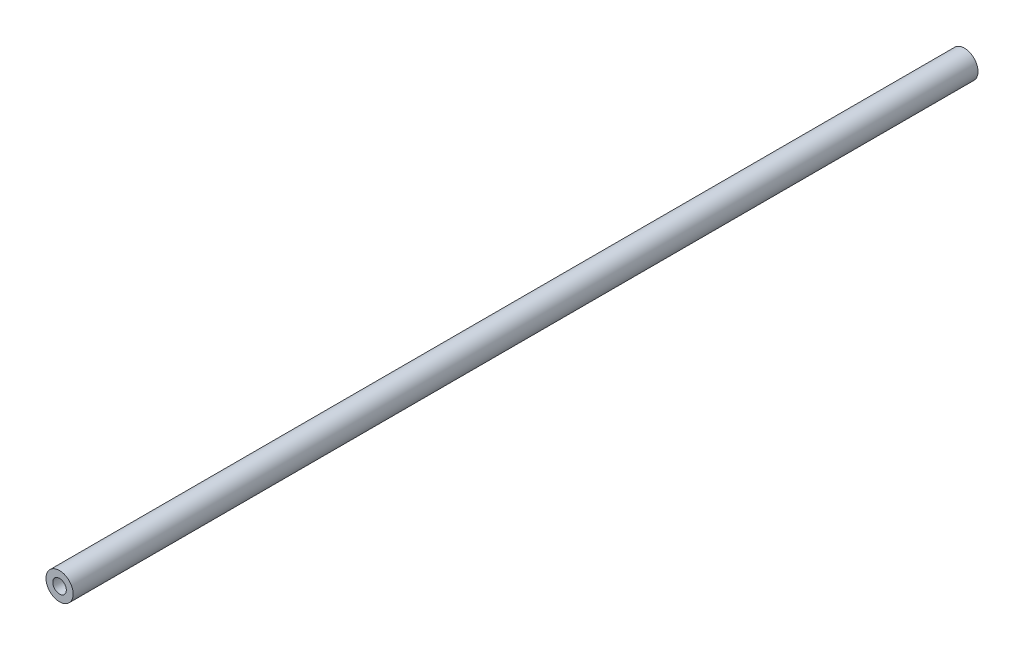
ISO-10303-21;
HEADER;
FILE_DESCRIPTION(('STEP AP214'),'2;1');
FILE_NAME('part.step','',(''),(''),'','','');
FILE_SCHEMA(('AUTOMOTIVE_DESIGN { 1 0 10303 214 1 1 1 1 }'));
ENDSEC;
DATA;
#1=APPLICATION_CONTEXT('core data for automotive mechanical design processes');
#2=APPLICATION_PROTOCOL_DEFINITION('international standard','automotive_design',2000,#1);
#3=PRODUCT_CONTEXT('',#1,'mechanical');
#4=PRODUCT('Part','Part','',(#3));
#5=PRODUCT_RELATED_PRODUCT_CATEGORY('part','',(#4));
#6=PRODUCT_DEFINITION_FORMATION('','',#4);
#7=PRODUCT_DEFINITION_CONTEXT('part definition',#1,'design');
#8=PRODUCT_DEFINITION('design','',#6,#7);
#9=PRODUCT_DEFINITION_SHAPE('','',#8);
#10=(LENGTH_UNIT() NAMED_UNIT(*) SI_UNIT(.MILLI.,.METRE.));
#11=(NAMED_UNIT(*) PLANE_ANGLE_UNIT() SI_UNIT($,.RADIAN.));
#12=(NAMED_UNIT(*) SI_UNIT($,.STERADIAN.) SOLID_ANGLE_UNIT());
#13=UNCERTAINTY_MEASURE_WITH_UNIT(LENGTH_MEASURE(1.E-05),#10,'distance_accuracy_value','');
#14=(GEOMETRIC_REPRESENTATION_CONTEXT(3) GLOBAL_UNCERTAINTY_ASSIGNED_CONTEXT((#13)) GLOBAL_UNIT_ASSIGNED_CONTEXT((#10,
#11,#12)) REPRESENTATION_CONTEXT('',''));
#15=CARTESIAN_POINT('',(0.,0.,0.));
#16=DIRECTION('',(0.,0.,1.));
#17=DIRECTION('',(1.,0.,0.));
#18=AXIS2_PLACEMENT_3D('',#15,#16,#17);
#19=CARTESIAN_POINT('',(0.,0.,100.));
#20=DIRECTION('',(0.,0.,-1.));
#21=DIRECTION('',(-1.,0.,0.));
#22=AXIS2_PLACEMENT_3D('',#19,#20,#21);
#23=CYLINDRICAL_SURFACE('',#22,3.);
#24=CARTESIAN_POINT('',(0.,0.,100.));
#25=DIRECTION('',(0.,0.,1.));
#26=DIRECTION('',(1.,0.,0.));
#27=AXIS2_PLACEMENT_3D('',#24,#25,#26);
#28=CIRCLE('',#27,3.);
#29=CARTESIAN_POINT('',(3.,0.,100.));
#30=VERTEX_POINT('',#29);
#31=EDGE_CURVE('E10',#30,#30,#28,.T.);
#32=ORIENTED_EDGE('',*,*,#31,.F.);
#33=EDGE_LOOP('',(#32));
#34=FACE_BOUND('',#33,.T.);
#35=CARTESIAN_POINT('',(0.,0.,-100.));
#36=DIRECTION('',(0.,0.,1.));
#37=DIRECTION('',(1.,0.,0.));
#38=AXIS2_PLACEMENT_3D('',#35,#36,#37);
#39=CIRCLE('',#38,3.);
#40=CARTESIAN_POINT('',(3.,0.,-100.));
#41=VERTEX_POINT('',#40);
#42=EDGE_CURVE('E42',#41,#41,#39,.T.);
#43=ORIENTED_EDGE('',*,*,#42,.T.);
#44=EDGE_LOOP('',(#43));
#45=FACE_BOUND('',#44,.T.);
#46=ADVANCED_FACE('F39',(#34,#45),#23,.T.);
#47=CARTESIAN_POINT('',(0.,0.,100.));
#48=DIRECTION('',(0.,0.,1.));
#49=DIRECTION('',(1.,0.,0.));
#50=AXIS2_PLACEMENT_3D('',#47,#48,#49);
#51=PLANE('',#50);
#52=CARTESIAN_POINT('',(0.,0.,100.));
#53=DIRECTION('',(0.,0.,1.));
#54=DIRECTION('',(1.,0.,0.));
#55=AXIS2_PLACEMENT_3D('',#52,#53,#54);
#56=CIRCLE('',#55,1.5);
#57=CARTESIAN_POINT('',(1.5,0.,100.));
#58=VERTEX_POINT('',#57);
#59=EDGE_CURVE('E53',#58,#58,#56,.T.);
#60=ORIENTED_EDGE('',*,*,#59,.F.);
#61=EDGE_LOOP('',(#60));
#62=FACE_BOUND('',#61,.T.);
#63=ORIENTED_EDGE('',*,*,#31,.T.);
#64=EDGE_LOOP('',(#63));
#65=FACE_BOUND('',#64,.T.);
#66=ADVANCED_FACE('F81',(#62,#65),#51,.T.);
#67=CARTESIAN_POINT('',(0.,0.,-100.));
#68=DIRECTION('',(0.,0.,1.));
#69=DIRECTION('',(1.,0.,0.));
#70=AXIS2_PLACEMENT_3D('',#67,#68,#69);
#71=PLANE('',#70);
#72=CARTESIAN_POINT('',(0.,0.,-100.));
#73=DIRECTION('',(0.,0.,1.));
#74=DIRECTION('',(1.,0.,0.));
#75=AXIS2_PLACEMENT_3D('',#72,#73,#74);
#76=CIRCLE('',#75,1.5);
#77=CARTESIAN_POINT('',(1.5,0.,-100.));
#78=VERTEX_POINT('',#77);
#79=EDGE_CURVE('E61',#78,#78,#76,.T.);
#80=ORIENTED_EDGE('',*,*,#79,.T.);
#81=EDGE_LOOP('',(#80));
#82=FACE_BOUND('',#81,.T.);
#83=ORIENTED_EDGE('',*,*,#42,.F.);
#84=EDGE_LOOP('',(#83));
#85=FACE_BOUND('',#84,.T.);
#86=ADVANCED_FACE('F86',(#82,#85),#71,.F.);
#87=CARTESIAN_POINT('',(0.,0.,90.));
#88=DIRECTION('',(0.,0.,1.));
#89=DIRECTION('',(1.,0.,0.));
#90=AXIS2_PLACEMENT_3D('',#87,#88,#89);
#91=CYLINDRICAL_SURFACE('',#90,1.5);
#92=CARTESIAN_POINT('',(0.,0.,90.));
#93=DIRECTION('',(0.,0.,1.));
#94=DIRECTION('',(1.,0.,0.));
#95=AXIS2_PLACEMENT_3D('',#92,#93,#94);
#96=CIRCLE('',#95,1.5);
#97=CARTESIAN_POINT('',(1.5,0.,90.));
#98=VERTEX_POINT('',#97);
#99=EDGE_CURVE('E51',#98,#98,#96,.T.);
#100=ORIENTED_EDGE('',*,*,#99,.F.);
#101=EDGE_LOOP('',(#100));
#102=FACE_BOUND('',#101,.T.);
#103=ORIENTED_EDGE('',*,*,#59,.T.);
#104=EDGE_LOOP('',(#103));
#105=FACE_BOUND('',#104,.T.);
#106=ADVANCED_FACE('F93',(#102,#105),#91,.F.);
#107=CARTESIAN_POINT('',(0.,0.,90.));
#108=DIRECTION('',(0.,0.,1.));
#109=DIRECTION('',(1.,0.,0.));
#110=AXIS2_PLACEMENT_3D('',#107,#108,#109);
#111=PLANE('',#110);
#112=ORIENTED_EDGE('',*,*,#99,.T.);
#113=EDGE_LOOP('',(#112));
#114=FACE_BOUND('',#113,.T.);
#115=ADVANCED_FACE('F78',(#114),#111,.T.);
#116=CARTESIAN_POINT('',(0.,0.,-90.));
#117=DIRECTION('',(0.,0.,-1.));
#118=DIRECTION('',(-1.,0.,0.));
#119=AXIS2_PLACEMENT_3D('',#116,#117,#118);
#120=CYLINDRICAL_SURFACE('',#119,1.5);
#121=CARTESIAN_POINT('',(0.,0.,-90.));
#122=DIRECTION('',(0.,0.,1.));
#123=DIRECTION('',(1.,0.,0.));
#124=AXIS2_PLACEMENT_3D('',#121,#122,#123);
#125=CIRCLE('',#124,1.5);
#126=CARTESIAN_POINT('',(1.5,0.,-90.));
#127=VERTEX_POINT('',#126);
#128=EDGE_CURVE('E57',#127,#127,#125,.T.);
#129=ORIENTED_EDGE('',*,*,#128,.T.);
#130=EDGE_LOOP('',(#129));
#131=FACE_BOUND('',#130,.T.);
#132=ORIENTED_EDGE('',*,*,#79,.F.);
#133=EDGE_LOOP('',(#132));
#134=FACE_BOUND('',#133,.T.);
#135=ADVANCED_FACE('F69',(#131,#134),#120,.F.);
#136=CARTESIAN_POINT('',(0.,0.,-90.));
#137=DIRECTION('',(0.,0.,-1.));
#138=DIRECTION('',(1.,0.,0.));
#139=AXIS2_PLACEMENT_3D('',#136,#137,#138);
#140=PLANE('',#139);
#141=ORIENTED_EDGE('',*,*,#128,.F.);
#142=EDGE_LOOP('',(#141));
#143=FACE_BOUND('',#142,.T.);
#144=ADVANCED_FACE('F72',(#143),#140,.T.);
#145=CLOSED_SHELL('',(#46,#66,#86,#106,#115,#135,#144));
#146=MANIFOLD_SOLID_BREP('B2',#145);
#147=ADVANCED_BREP_SHAPE_REPRESENTATION('',(#18,#146),#14);
#148=SHAPE_DEFINITION_REPRESENTATION(#9,#147);
ENDSEC;
END-ISO-10303-21;
